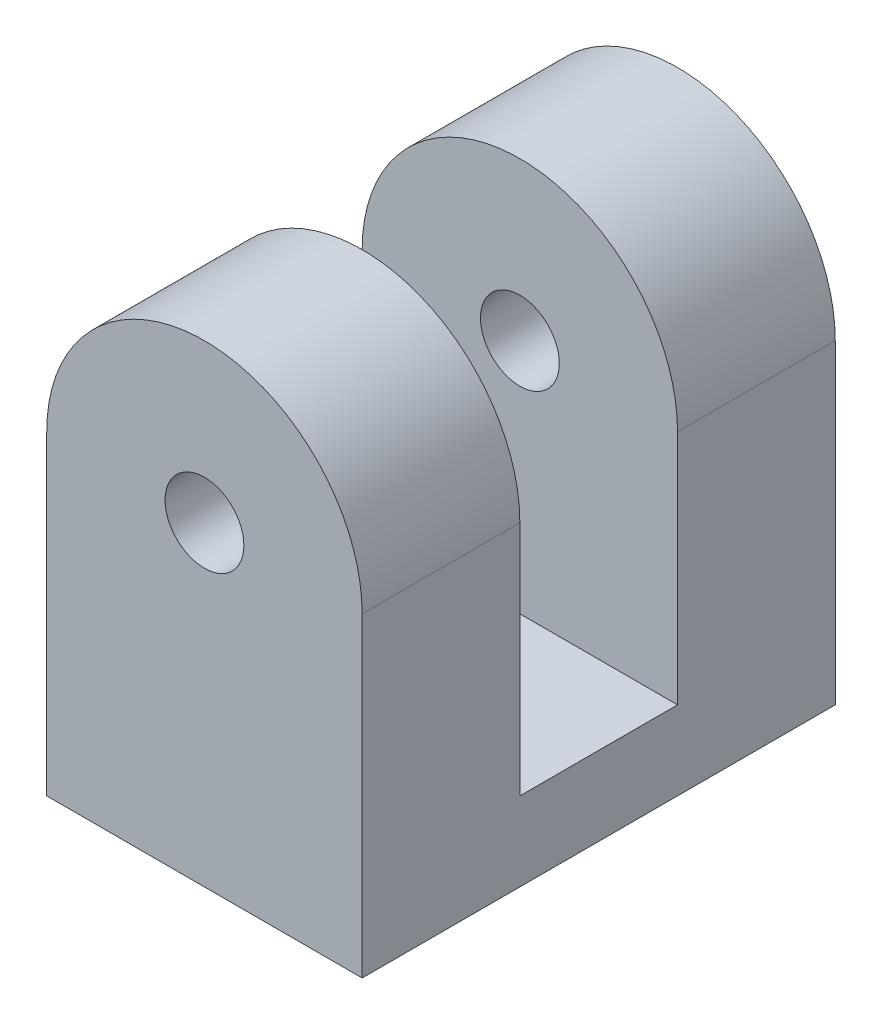
ISO-10303-21;
HEADER;
FILE_DESCRIPTION(('STEP AP214'),'2;1');
FILE_NAME('part.step','',(''),(''),'','','');
FILE_SCHEMA(('AUTOMOTIVE_DESIGN { 1 0 10303 214 1 1 1 1 }'));
ENDSEC;
DATA;
#1=APPLICATION_CONTEXT('core data for automotive mechanical design processes');
#2=APPLICATION_PROTOCOL_DEFINITION('international standard','automotive_design',2000,#1);
#3=PRODUCT_CONTEXT('',#1,'mechanical');
#4=PRODUCT('Part','Part','',(#3));
#5=PRODUCT_RELATED_PRODUCT_CATEGORY('part','',(#4));
#6=PRODUCT_DEFINITION_FORMATION('','',#4);
#7=PRODUCT_DEFINITION_CONTEXT('part definition',#1,'design');
#8=PRODUCT_DEFINITION('design','',#6,#7);
#9=PRODUCT_DEFINITION_SHAPE('','',#8);
#10=(LENGTH_UNIT() NAMED_UNIT(*) SI_UNIT(.MILLI.,.METRE.));
#11=(NAMED_UNIT(*) PLANE_ANGLE_UNIT() SI_UNIT($,.RADIAN.));
#12=(NAMED_UNIT(*) SI_UNIT($,.STERADIAN.) SOLID_ANGLE_UNIT());
#13=UNCERTAINTY_MEASURE_WITH_UNIT(LENGTH_MEASURE(1.E-05),#10,'distance_accuracy_value','');
#14=(GEOMETRIC_REPRESENTATION_CONTEXT(3) GLOBAL_UNCERTAINTY_ASSIGNED_CONTEXT((#13)) GLOBAL_UNIT_ASSIGNED_CONTEXT((#10,
#11,#12)) REPRESENTATION_CONTEXT('',''));
#15=CARTESIAN_POINT('',(0.,0.,0.));
#16=DIRECTION('',(0.,0.,1.));
#17=DIRECTION('',(1.,0.,0.));
#18=AXIS2_PLACEMENT_3D('',#15,#16,#17);
#19=CARTESIAN_POINT('',(0.,0.,0.));
#20=DIRECTION('',(0.,-1.,0.));
#21=DIRECTION('',(1.,0.,0.));
#22=AXIS2_PLACEMENT_3D('',#19,#20,#21);
#23=PLANE('',#22);
#24=DIRECTION('',(1.,0.,0.));
#25=VECTOR('',#24,1.);
#26=CARTESIAN_POINT('',(-9.99999999999999,0.,-5.));
#27=LINE('',#26,#25);
#28=CARTESIAN_POINT('',(-9.99999999999999,0.,-5.));
#29=VERTEX_POINT('',#28);
#30=CARTESIAN_POINT('',(10.,0.,-5.));
#31=VERTEX_POINT('',#30);
#32=EDGE_CURVE('E105',#29,#31,#27,.T.);
#33=ORIENTED_EDGE('',*,*,#32,.F.);
#34=DIRECTION('',(0.,0.,-1.));
#35=VECTOR('',#34,1.);
#36=CARTESIAN_POINT('',(-10.,0.,15.));
#37=LINE('',#36,#35);
#38=CARTESIAN_POINT('',(-9.99999999999999,0.,5.));
#39=VERTEX_POINT('',#38);
#40=EDGE_CURVE('E86',#39,#29,#37,.T.);
#41=ORIENTED_EDGE('',*,*,#40,.F.);
#42=DIRECTION('',(1.,0.,0.));
#43=VECTOR('',#42,1.);
#44=CARTESIAN_POINT('',(-9.99999999999999,0.,5.));
#45=LINE('',#44,#43);
#46=CARTESIAN_POINT('',(10.,0.,5.));
#47=VERTEX_POINT('',#46);
#48=EDGE_CURVE('E90',#39,#47,#45,.T.);
#49=ORIENTED_EDGE('',*,*,#48,.T.);
#50=DIRECTION('',(0.,0.,1.));
#51=VECTOR('',#50,1.);
#52=CARTESIAN_POINT('',(10.,0.,15.));
#53=LINE('',#52,#51);
#54=EDGE_CURVE('E108',#31,#47,#53,.T.);
#55=ORIENTED_EDGE('',*,*,#54,.F.);
#56=EDGE_LOOP('',(#33,#41,#49,#55));
#57=FACE_BOUND('',#56,.T.);
#58=ADVANCED_FACE('F45',(#57),#23,.F.);
#59=CARTESIAN_POINT('',(0.,15.,15.));
#60=DIRECTION('',(0.,0.,-1.));
#61=DIRECTION('',(-1.,0.,0.));
#62=AXIS2_PLACEMENT_3D('',#59,#60,#61);
#63=PLANE('',#62);
#64=DIRECTION('',(0.,1.,0.));
#65=VECTOR('',#64,1.);
#66=CARTESIAN_POINT('',(10.,15.,15.));
#67=LINE('',#66,#65);
#68=CARTESIAN_POINT('',(10.,-5.,15.));
#69=VERTEX_POINT('',#68);
#70=CARTESIAN_POINT('',(10.,15.,15.));
#71=VERTEX_POINT('',#70);
#72=EDGE_CURVE('E101',#69,#71,#67,.T.);
#73=ORIENTED_EDGE('',*,*,#72,.T.);
#74=CARTESIAN_POINT('',(0.,15.,15.));
#75=DIRECTION('',(0.,0.,1.));
#76=DIRECTION('',(-1.,0.,0.));
#77=AXIS2_PLACEMENT_3D('',#74,#75,#76);
#78=CIRCLE('',#77,10.);
#79=CARTESIAN_POINT('',(-10.,15.,15.));
#80=VERTEX_POINT('',#79);
#81=EDGE_CURVE('E63',#71,#80,#78,.T.);
#82=ORIENTED_EDGE('',*,*,#81,.T.);
#83=DIRECTION('',(0.,-1.,0.));
#84=VECTOR('',#83,1.);
#85=CARTESIAN_POINT('',(-10.,15.,15.));
#86=LINE('',#85,#84);
#87=CARTESIAN_POINT('',(-10.,-5.,15.));
#88=VERTEX_POINT('',#87);
#89=EDGE_CURVE('E141',#80,#88,#86,.T.);
#90=ORIENTED_EDGE('',*,*,#89,.T.);
#91=DIRECTION('',(-1.,0.,0.));
#92=VECTOR('',#91,1.);
#93=CARTESIAN_POINT('',(-10.,-5.,15.));
#94=LINE('',#93,#92);
#95=EDGE_CURVE('E113',#69,#88,#94,.T.);
#96=ORIENTED_EDGE('',*,*,#95,.F.);
#97=EDGE_LOOP('',(#73,#82,#90,#96));
#98=FACE_BOUND('',#97,.T.);
#99=CARTESIAN_POINT('',(0.,15.,15.));
#100=DIRECTION('',(0.,0.,1.));
#101=DIRECTION('',(1.,0.,0.));
#102=AXIS2_PLACEMENT_3D('',#99,#100,#101);
#103=CIRCLE('',#102,2.5);
#104=CARTESIAN_POINT('',(2.5,15.,15.));
#105=VERTEX_POINT('',#104);
#106=EDGE_CURVE('E130',#105,#105,#103,.T.);
#107=ORIENTED_EDGE('',*,*,#106,.F.);
#108=EDGE_LOOP('',(#107));
#109=FACE_BOUND('',#108,.T.);
#110=ADVANCED_FACE('F239',(#98,#109),#63,.F.);
#111=CARTESIAN_POINT('',(0.,15.,5.));
#112=DIRECTION('',(0.,0.,-1.));
#113=DIRECTION('',(-1.,0.,0.));
#114=AXIS2_PLACEMENT_3D('',#111,#112,#113);
#115=PLANE('',#114);
#116=DIRECTION('',(0.,1.,0.));
#117=VECTOR('',#116,1.);
#118=CARTESIAN_POINT('',(10.,15.,5.));
#119=LINE('',#118,#117);
#120=CARTESIAN_POINT('',(10.,15.,5.));
#121=VERTEX_POINT('',#120);
#122=EDGE_CURVE('E97',#47,#121,#119,.T.);
#123=ORIENTED_EDGE('',*,*,#122,.F.);
#124=ORIENTED_EDGE('',*,*,#48,.F.);
#125=DIRECTION('',(0.,-1.,0.));
#126=VECTOR('',#125,1.);
#127=CARTESIAN_POINT('',(-10.,15.,5.));
#128=LINE('',#127,#126);
#129=CARTESIAN_POINT('',(-10.,15.,5.));
#130=VERTEX_POINT('',#129);
#131=EDGE_CURVE('E80',#130,#39,#128,.T.);
#132=ORIENTED_EDGE('',*,*,#131,.F.);
#133=CARTESIAN_POINT('',(0.,15.,5.));
#134=DIRECTION('',(0.,0.,1.));
#135=DIRECTION('',(-1.,0.,0.));
#136=AXIS2_PLACEMENT_3D('',#133,#134,#135);
#137=CIRCLE('',#136,10.);
#138=EDGE_CURVE('E74',#121,#130,#137,.T.);
#139=ORIENTED_EDGE('',*,*,#138,.F.);
#140=EDGE_LOOP('',(#123,#124,#132,#139));
#141=FACE_BOUND('',#140,.T.);
#142=CARTESIAN_POINT('',(0.,15.,5.));
#143=DIRECTION('',(0.,0.,1.));
#144=DIRECTION('',(1.,0.,0.));
#145=AXIS2_PLACEMENT_3D('',#142,#143,#144);
#146=CIRCLE('',#145,2.5);
#147=CARTESIAN_POINT('',(2.5,15.,5.));
#148=VERTEX_POINT('',#147);
#149=EDGE_CURVE('E129',#148,#148,#146,.T.);
#150=ORIENTED_EDGE('',*,*,#149,.T.);
#151=EDGE_LOOP('',(#150));
#152=FACE_BOUND('',#151,.T.);
#153=ADVANCED_FACE('F94',(#141,#152),#115,.T.);
#154=CARTESIAN_POINT('',(10.,15.,15.));
#155=DIRECTION('',(-1.,0.,0.));
#156=DIRECTION('',(0.,-1.,0.));
#157=AXIS2_PLACEMENT_3D('',#154,#155,#156);
#158=PLANE('',#157);
#159=ORIENTED_EDGE('',*,*,#122,.T.);
#160=DIRECTION('',(0.,0.,-1.));
#161=VECTOR('',#160,1.);
#162=CARTESIAN_POINT('',(10.,15.,15.));
#163=LINE('',#162,#161);
#164=EDGE_CURVE('E11',#71,#121,#163,.T.);
#165=ORIENTED_EDGE('',*,*,#164,.F.);
#166=ORIENTED_EDGE('',*,*,#72,.F.);
#167=DIRECTION('',(0.,0.,1.));
#168=VECTOR('',#167,1.);
#169=CARTESIAN_POINT('',(10.,-5.,15.));
#170=LINE('',#169,#168);
#171=CARTESIAN_POINT('',(10.,-5.,-15.));
#172=VERTEX_POINT('',#171);
#173=EDGE_CURVE('E107',#172,#69,#170,.T.);
#174=ORIENTED_EDGE('',*,*,#173,.F.);
#175=DIRECTION('',(0.,1.,0.));
#176=VECTOR('',#175,1.);
#177=CARTESIAN_POINT('',(10.,-5.,-15.));
#178=LINE('',#177,#176);
#179=CARTESIAN_POINT('',(10.,15.,-15.));
#180=VERTEX_POINT('',#179);
#181=EDGE_CURVE('E120',#172,#180,#178,.T.);
#182=ORIENTED_EDGE('',*,*,#181,.T.);
#183=DIRECTION('',(0.,0.,1.));
#184=VECTOR('',#183,1.);
#185=CARTESIAN_POINT('',(10.,15.,-15.));
#186=LINE('',#185,#184);
#187=CARTESIAN_POINT('',(10.,15.,-5.));
#188=VERTEX_POINT('',#187);
#189=EDGE_CURVE('E162',#180,#188,#186,.T.);
#190=ORIENTED_EDGE('',*,*,#189,.T.);
#191=DIRECTION('',(0.,1.,0.));
#192=VECTOR('',#191,1.);
#193=CARTESIAN_POINT('',(10.,15.,-5.));
#194=LINE('',#193,#192);
#195=EDGE_CURVE('E180',#31,#188,#194,.T.);
#196=ORIENTED_EDGE('',*,*,#195,.F.);
#197=ORIENTED_EDGE('',*,*,#54,.T.);
#198=EDGE_LOOP('',(#159,#165,#166,#174,#182,#190,#196,#197));
#199=FACE_BOUND('',#198,.T.);
#200=ADVANCED_FACE('F47',(#199),#158,.F.);
#201=CARTESIAN_POINT('',(0.,15.,15.));
#202=DIRECTION('',(0.,0.,-1.));
#203=DIRECTION('',(-1.,0.,0.));
#204=AXIS2_PLACEMENT_3D('',#201,#202,#203);
#205=CYLINDRICAL_SURFACE('',#204,10.);
#206=ORIENTED_EDGE('',*,*,#138,.T.);
#207=DIRECTION('',(0.,0.,-1.));
#208=VECTOR('',#207,1.);
#209=CARTESIAN_POINT('',(-10.,15.,15.));
#210=LINE('',#209,#208);
#211=EDGE_CURVE('E55',#80,#130,#210,.T.);
#212=ORIENTED_EDGE('',*,*,#211,.F.);
#213=ORIENTED_EDGE('',*,*,#81,.F.);
#214=ORIENTED_EDGE('',*,*,#164,.T.);
#215=EDGE_LOOP('',(#206,#212,#213,#214));
#216=FACE_BOUND('',#215,.T.);
#217=ADVANCED_FACE('F266',(#216),#205,.T.);
#218=CARTESIAN_POINT('',(-10.,15.,15.));
#219=DIRECTION('',(1.,0.,0.));
#220=DIRECTION('',(0.,1.,0.));
#221=AXIS2_PLACEMENT_3D('',#218,#219,#220);
#222=PLANE('',#221);
#223=ORIENTED_EDGE('',*,*,#131,.T.);
#224=ORIENTED_EDGE('',*,*,#40,.T.);
#225=DIRECTION('',(0.,-1.,0.));
#226=VECTOR('',#225,1.);
#227=CARTESIAN_POINT('',(-10.,15.,-5.));
#228=LINE('',#227,#226);
#229=CARTESIAN_POINT('',(-10.,15.,-5.));
#230=VERTEX_POINT('',#229);
#231=EDGE_CURVE('E172',#230,#29,#228,.T.);
#232=ORIENTED_EDGE('',*,*,#231,.F.);
#233=DIRECTION('',(0.,0.,1.));
#234=VECTOR('',#233,1.);
#235=CARTESIAN_POINT('',(-10.,15.,-15.));
#236=LINE('',#235,#234);
#237=CARTESIAN_POINT('',(-10.,15.,-15.));
#238=VERTEX_POINT('',#237);
#239=EDGE_CURVE('E116',#238,#230,#236,.T.);
#240=ORIENTED_EDGE('',*,*,#239,.F.);
#241=DIRECTION('',(0.,1.,0.));
#242=VECTOR('',#241,1.);
#243=CARTESIAN_POINT('',(-10.,-5.,-15.));
#244=LINE('',#243,#242);
#245=CARTESIAN_POINT('',(-10.,-5.,-15.));
#246=VERTEX_POINT('',#245);
#247=EDGE_CURVE('E124',#246,#238,#244,.T.);
#248=ORIENTED_EDGE('',*,*,#247,.F.);
#249=DIRECTION('',(0.,0.,-1.));
#250=VECTOR('',#249,1.);
#251=CARTESIAN_POINT('',(-10.,-5.,15.));
#252=LINE('',#251,#250);
#253=EDGE_CURVE('E151',#88,#246,#252,.T.);
#254=ORIENTED_EDGE('',*,*,#253,.F.);
#255=ORIENTED_EDGE('',*,*,#89,.F.);
#256=ORIENTED_EDGE('',*,*,#211,.T.);
#257=EDGE_LOOP('',(#223,#224,#232,#240,#248,#254,#255,#256));
#258=FACE_BOUND('',#257,.T.);
#259=ADVANCED_FACE('F82',(#258),#222,.F.);
#260=CARTESIAN_POINT('',(0.,15.,15.));
#261=DIRECTION('',(0.,0.,-1.));
#262=DIRECTION('',(-1.,0.,0.));
#263=AXIS2_PLACEMENT_3D('',#260,#261,#262);
#264=CYLINDRICAL_SURFACE('',#263,2.5);
#265=ORIENTED_EDGE('',*,*,#106,.T.);
#266=EDGE_LOOP('',(#265));
#267=FACE_BOUND('',#266,.T.);
#268=ORIENTED_EDGE('',*,*,#149,.F.);
#269=EDGE_LOOP('',(#268));
#270=FACE_BOUND('',#269,.T.);
#271=ADVANCED_FACE('F260',(#267,#270),#264,.F.);
#272=CARTESIAN_POINT('',(-10.,-5.,-15.));
#273=DIRECTION('',(0.,0.,1.));
#274=DIRECTION('',(1.,0.,0.));
#275=AXIS2_PLACEMENT_3D('',#272,#273,#274);
#276=PLANE('',#275);
#277=ORIENTED_EDGE('',*,*,#247,.T.);
#278=CARTESIAN_POINT('',(0.,15.,-15.));
#279=DIRECTION('',(0.,0.,1.));
#280=DIRECTION('',(-1.,0.,0.));
#281=AXIS2_PLACEMENT_3D('',#278,#279,#280);
#282=CIRCLE('',#281,10.);
#283=EDGE_CURVE('E166',#180,#238,#282,.T.);
#284=ORIENTED_EDGE('',*,*,#283,.F.);
#285=ORIENTED_EDGE('',*,*,#181,.F.);
#286=DIRECTION('',(1.,0.,0.));
#287=VECTOR('',#286,1.);
#288=CARTESIAN_POINT('',(-10.,-5.,-15.));
#289=LINE('',#288,#287);
#290=EDGE_CURVE('E125',#246,#172,#289,.T.);
#291=ORIENTED_EDGE('',*,*,#290,.F.);
#292=EDGE_LOOP('',(#277,#284,#285,#291));
#293=FACE_BOUND('',#292,.T.);
#294=CARTESIAN_POINT('',(0.,15.,-15.));
#295=DIRECTION('',(0.,0.,1.));
#296=DIRECTION('',(1.,0.,0.));
#297=AXIS2_PLACEMENT_3D('',#294,#295,#296);
#298=CIRCLE('',#297,2.5);
#299=CARTESIAN_POINT('',(2.5,15.,-15.));
#300=VERTEX_POINT('',#299);
#301=EDGE_CURVE('E184',#300,#300,#298,.T.);
#302=ORIENTED_EDGE('',*,*,#301,.T.);
#303=EDGE_LOOP('',(#302));
#304=FACE_BOUND('',#303,.T.);
#305=ADVANCED_FACE('F196',(#293,#304),#276,.F.);
#306=CARTESIAN_POINT('',(0.,-5.,0.));
#307=DIRECTION('',(0.,-1.,0.));
#308=DIRECTION('',(1.,0.,0.));
#309=AXIS2_PLACEMENT_3D('',#306,#307,#308);
#310=PLANE('',#309);
#311=ORIENTED_EDGE('',*,*,#173,.T.);
#312=ORIENTED_EDGE('',*,*,#95,.T.);
#313=ORIENTED_EDGE('',*,*,#253,.T.);
#314=ORIENTED_EDGE('',*,*,#290,.T.);
#315=EDGE_LOOP('',(#311,#312,#313,#314));
#316=FACE_BOUND('',#315,.T.);
#317=ADVANCED_FACE('F233',(#316),#310,.T.);
#318=CARTESIAN_POINT('',(0.,15.,-15.));
#319=DIRECTION('',(0.,0.,1.));
#320=DIRECTION('',(1.,0.,0.));
#321=AXIS2_PLACEMENT_3D('',#318,#319,#320);
#322=CYLINDRICAL_SURFACE('',#321,10.);
#323=CARTESIAN_POINT('',(0.,15.,-5.));
#324=DIRECTION('',(0.,0.,1.));
#325=DIRECTION('',(-1.,0.,0.));
#326=AXIS2_PLACEMENT_3D('',#323,#324,#325);
#327=CIRCLE('',#326,10.);
#328=EDGE_CURVE('E176',#188,#230,#327,.T.);
#329=ORIENTED_EDGE('',*,*,#328,.F.);
#330=ORIENTED_EDGE('',*,*,#189,.F.);
#331=ORIENTED_EDGE('',*,*,#283,.T.);
#332=ORIENTED_EDGE('',*,*,#239,.T.);
#333=EDGE_LOOP('',(#329,#330,#331,#332));
#334=FACE_BOUND('',#333,.T.);
#335=ADVANCED_FACE('F207',(#334),#322,.T.);
#336=CARTESIAN_POINT('',(0.,15.,-5.));
#337=DIRECTION('',(0.,0.,-1.));
#338=DIRECTION('',(-1.,0.,0.));
#339=AXIS2_PLACEMENT_3D('',#336,#337,#338);
#340=PLANE('',#339);
#341=CARTESIAN_POINT('',(0.,15.,-5.));
#342=DIRECTION('',(0.,0.,1.));
#343=DIRECTION('',(1.,0.,0.));
#344=AXIS2_PLACEMENT_3D('',#341,#342,#343);
#345=CIRCLE('',#344,2.5);
#346=CARTESIAN_POINT('',(2.5,15.,-5.));
#347=VERTEX_POINT('',#346);
#348=EDGE_CURVE('E188',#347,#347,#345,.T.);
#349=ORIENTED_EDGE('',*,*,#348,.F.);
#350=EDGE_LOOP('',(#349));
#351=FACE_BOUND('',#350,.T.);
#352=ORIENTED_EDGE('',*,*,#195,.T.);
#353=ORIENTED_EDGE('',*,*,#328,.T.);
#354=ORIENTED_EDGE('',*,*,#231,.T.);
#355=ORIENTED_EDGE('',*,*,#32,.T.);
#356=EDGE_LOOP('',(#352,#353,#354,#355));
#357=FACE_BOUND('',#356,.T.);
#358=ADVANCED_FACE('F201',(#351,#357),#340,.F.);
#359=CARTESIAN_POINT('',(0.,15.,-15.));
#360=DIRECTION('',(0.,0.,1.));
#361=DIRECTION('',(1.,0.,0.));
#362=AXIS2_PLACEMENT_3D('',#359,#360,#361);
#363=CYLINDRICAL_SURFACE('',#362,2.5);
#364=ORIENTED_EDGE('',*,*,#301,.F.);
#365=EDGE_LOOP('',(#364));
#366=FACE_BOUND('',#365,.T.);
#367=ORIENTED_EDGE('',*,*,#348,.T.);
#368=EDGE_LOOP('',(#367));
#369=FACE_BOUND('',#368,.T.);
#370=ADVANCED_FACE('F198',(#366,#369),#363,.F.);
#371=CLOSED_SHELL('',(#58,#110,#153,#200,#217,#259,#271,#305,#317,#335,#358,#370));
#372=MANIFOLD_SOLID_BREP('B2',#371);
#373=ADVANCED_BREP_SHAPE_REPRESENTATION('',(#18,#372),#14);
#374=SHAPE_DEFINITION_REPRESENTATION(#9,#373);
ENDSEC;
END-ISO-10303-21;
